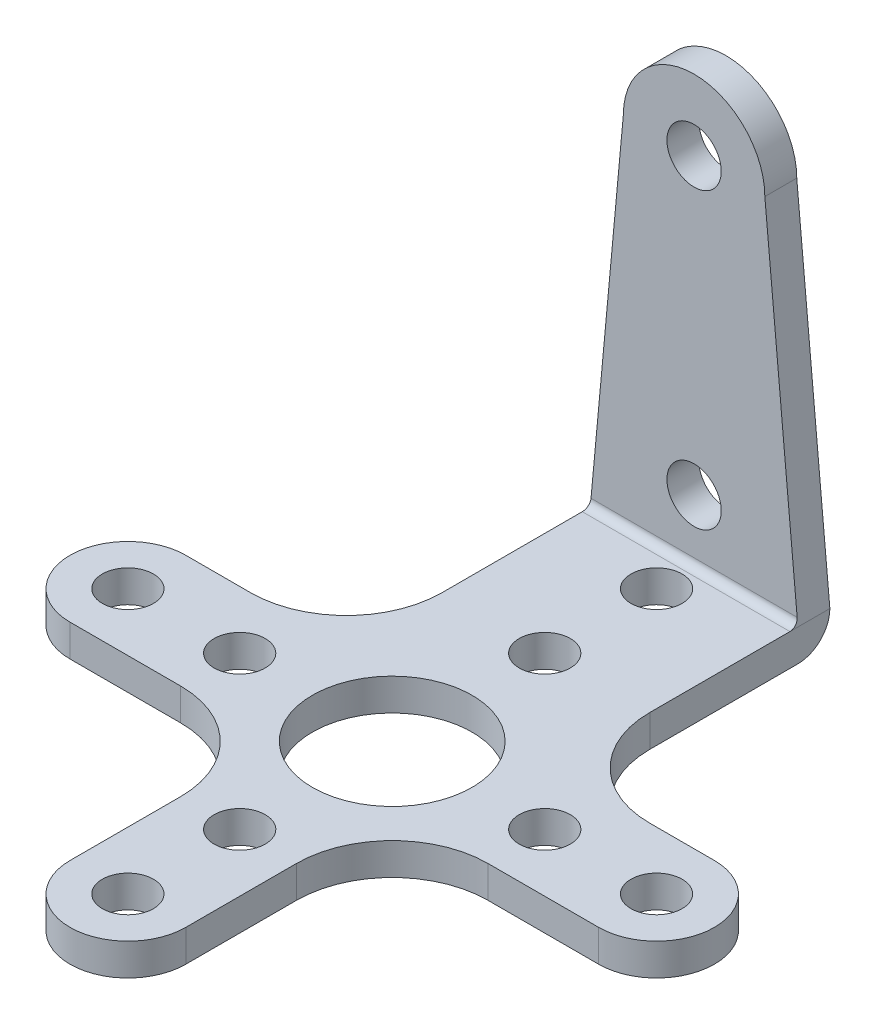
ISO-10303-21;
HEADER;
FILE_DESCRIPTION(('STEP AP214'),'2;1');
FILE_NAME('part.step','',(''),(''),'','','');
FILE_SCHEMA(('AUTOMOTIVE_DESIGN { 1 0 10303 214 1 1 1 1 }'));
ENDSEC;
DATA;
#1=APPLICATION_CONTEXT('core data for automotive mechanical design processes');
#2=APPLICATION_PROTOCOL_DEFINITION('international standard','automotive_design',2000,#1);
#3=PRODUCT_CONTEXT('',#1,'mechanical');
#4=PRODUCT('Part','Part','',(#3));
#5=PRODUCT_RELATED_PRODUCT_CATEGORY('part','',(#4));
#6=PRODUCT_DEFINITION_FORMATION('','',#4);
#7=PRODUCT_DEFINITION_CONTEXT('part definition',#1,'design');
#8=PRODUCT_DEFINITION('design','',#6,#7);
#9=PRODUCT_DEFINITION_SHAPE('','',#8);
#10=(LENGTH_UNIT() NAMED_UNIT(*) SI_UNIT(.MILLI.,.METRE.));
#11=(NAMED_UNIT(*) PLANE_ANGLE_UNIT() SI_UNIT($,.RADIAN.));
#12=(NAMED_UNIT(*) SI_UNIT($,.STERADIAN.) SOLID_ANGLE_UNIT());
#13=UNCERTAINTY_MEASURE_WITH_UNIT(LENGTH_MEASURE(1.E-05),#10,'distance_accuracy_value','');
#14=(GEOMETRIC_REPRESENTATION_CONTEXT(3) GLOBAL_UNCERTAINTY_ASSIGNED_CONTEXT((#13)) GLOBAL_UNIT_ASSIGNED_CONTEXT((#10,
#11,#12)) REPRESENTATION_CONTEXT('',''));
#15=CARTESIAN_POINT('',(0.,0.,0.));
#16=DIRECTION('',(0.,0.,1.));
#17=DIRECTION('',(1.,0.,0.));
#18=AXIS2_PLACEMENT_3D('',#15,#16,#17);
#19=CARTESIAN_POINT('',(-16.55,2.,0.));
#20=DIRECTION('',(0.,-1.,0.));
#21=DIRECTION('',(0.,0.,-1.));
#22=AXIS2_PLACEMENT_3D('',#19,#20,#21);
#23=PLANE('',#22);
#24=DIRECTION('',(0.,0.,-1.));
#25=VECTOR('',#24,1.);
#26=CARTESIAN_POINT('',(6.5,2.,-9.62500000000003));
#27=LINE('',#26,#25);
#28=CARTESIAN_POINT('',(6.5,2.,-9.62500000000003));
#29=VERTEX_POINT('',#28);
#30=CARTESIAN_POINT('',(6.5,2.,-18.4));
#31=VERTEX_POINT('',#30);
#32=EDGE_CURVE('E304',#29,#31,#27,.T.);
#33=ORIENTED_EDGE('',*,*,#32,.T.);
#34=DIRECTION('',(-1.,0.,0.));
#35=VECTOR('',#34,1.);
#36=CARTESIAN_POINT('',(-6.5,2.,-18.4));
#37=LINE('',#36,#35);
#38=CARTESIAN_POINT('',(-6.5,2.,-18.4));
#39=VERTEX_POINT('',#38);
#40=EDGE_CURVE('E384',#31,#39,#37,.T.);
#41=ORIENTED_EDGE('',*,*,#40,.T.);
#42=DIRECTION('',(0.,0.,1.));
#43=VECTOR('',#42,1.);
#44=CARTESIAN_POINT('',(-6.5,2.,-9.62500000000004));
#45=LINE('',#44,#43);
#46=CARTESIAN_POINT('',(-6.5,2.,-9.62500000000004));
#47=VERTEX_POINT('',#46);
#48=EDGE_CURVE('E198',#39,#47,#45,.T.);
#49=ORIENTED_EDGE('',*,*,#48,.T.);
#50=CARTESIAN_POINT('',(-12.5,2.,-9.62499999999999));
#51=DIRECTION('',(0.,-1.,0.));
#52=DIRECTION('',(0.,0.,-1.));
#53=AXIS2_PLACEMENT_3D('',#50,#51,#52);
#54=CIRCLE('',#53,6.);
#55=CARTESIAN_POINT('',(-12.5,2.,-3.62499999999999));
#56=VERTEX_POINT('',#55);
#57=EDGE_CURVE('E307',#47,#56,#54,.T.);
#58=ORIENTED_EDGE('',*,*,#57,.T.);
#59=DIRECTION('',(-1.,0.,0.));
#60=VECTOR('',#59,1.);
#61=CARTESIAN_POINT('',(-16.55,2.,-3.62499999999999));
#62=LINE('',#61,#60);
#63=CARTESIAN_POINT('',(-16.55,2.,-3.62499999999999));
#64=VERTEX_POINT('',#63);
#65=EDGE_CURVE('E309',#56,#64,#62,.T.);
#66=ORIENTED_EDGE('',*,*,#65,.T.);
#67=CARTESIAN_POINT('',(-16.55,2.,0.));
#68=DIRECTION('',(0.,1.,0.));
#69=DIRECTION('',(0.,0.,-1.));
#70=AXIS2_PLACEMENT_3D('',#67,#68,#69);
#71=CIRCLE('',#70,3.625);
#72=CARTESIAN_POINT('',(-16.55,2.,3.625));
#73=VERTEX_POINT('',#72);
#74=EDGE_CURVE('E280',#64,#73,#71,.T.);
#75=ORIENTED_EDGE('',*,*,#74,.T.);
#76=DIRECTION('',(1.,0.,0.));
#77=VECTOR('',#76,1.);
#78=CARTESIAN_POINT('',(-16.55,2.,3.625));
#79=LINE('',#78,#77);
#80=CARTESIAN_POINT('',(-9.62499999999988,2.,3.625));
#81=VERTEX_POINT('',#80);
#82=EDGE_CURVE('E283',#73,#81,#79,.T.);
#83=ORIENTED_EDGE('',*,*,#82,.T.);
#84=CARTESIAN_POINT('',(-9.62499999999984,2.,9.625));
#85=DIRECTION('',(0.,-1.,0.));
#86=DIRECTION('',(0.,0.,1.));
#87=AXIS2_PLACEMENT_3D('',#84,#85,#86);
#88=CIRCLE('',#87,6.);
#89=CARTESIAN_POINT('',(-3.62499999999984,2.,9.62499999999994));
#90=VERTEX_POINT('',#89);
#91=EDGE_CURVE('E286',#81,#90,#88,.T.);
#92=ORIENTED_EDGE('',*,*,#91,.T.);
#93=DIRECTION('',(0.,0.,1.));
#94=VECTOR('',#93,1.);
#95=CARTESIAN_POINT('',(-3.62499999999972,2.,16.5500000000001));
#96=LINE('',#95,#94);
#97=CARTESIAN_POINT('',(-3.62499999999972,2.,16.5500000000001));
#98=VERTEX_POINT('',#97);
#99=EDGE_CURVE('E288',#90,#98,#96,.T.);
#100=ORIENTED_EDGE('',*,*,#99,.T.);
#101=CARTESIAN_POINT('',(2.81025203108243E-13,2.,16.55));
#102=DIRECTION('',(0.,1.,0.));
#103=DIRECTION('',(0.,0.,1.));
#104=AXIS2_PLACEMENT_3D('',#101,#102,#103);
#105=CIRCLE('',#104,3.625);
#106=CARTESIAN_POINT('',(3.62500000000028,2.,16.5499999999999));
#107=VERTEX_POINT('',#106);
#108=EDGE_CURVE('E290',#98,#107,#105,.T.);
#109=ORIENTED_EDGE('',*,*,#108,.T.);
#110=DIRECTION('',(0.,0.,-1.));
#111=VECTOR('',#110,1.);
#112=CARTESIAN_POINT('',(3.62500000000028,2.,16.5499999999999));
#113=LINE('',#112,#111);
#114=CARTESIAN_POINT('',(3.62499999999998,2.,9.62500000000026));
#115=VERTEX_POINT('',#114);
#116=EDGE_CURVE('E292',#107,#115,#113,.T.);
#117=ORIENTED_EDGE('',*,*,#116,.T.);
#118=CARTESIAN_POINT('',(9.6250000000001,2.,9.62500000000001));
#119=DIRECTION('',(0.,-1.,0.));
#120=DIRECTION('',(0.,0.,1.));
#121=AXIS2_PLACEMENT_3D('',#118,#119,#120);
#122=CIRCLE('',#121,6.00000000000006);
#123=CARTESIAN_POINT('',(9.62499999999998,2.,3.62499999999995));
#124=VERTEX_POINT('',#123);
#125=EDGE_CURVE('E294',#115,#124,#122,.T.);
#126=ORIENTED_EDGE('',*,*,#125,.T.);
#127=DIRECTION('',(1.,0.,0.));
#128=VECTOR('',#127,1.);
#129=CARTESIAN_POINT('',(16.55,2.,3.62500000000001));
#130=LINE('',#129,#128);
#131=CARTESIAN_POINT('',(16.55,2.,3.62500000000001));
#132=VERTEX_POINT('',#131);
#133=EDGE_CURVE('E296',#124,#132,#130,.T.);
#134=ORIENTED_EDGE('',*,*,#133,.T.);
#135=CARTESIAN_POINT('',(16.55,2.,0.));
#136=DIRECTION('',(0.,1.,0.));
#137=DIRECTION('',(0.,0.,1.));
#138=AXIS2_PLACEMENT_3D('',#135,#136,#137);
#139=CIRCLE('',#138,3.625);
#140=CARTESIAN_POINT('',(16.55,2.,-3.62500000000001));
#141=VERTEX_POINT('',#140);
#142=EDGE_CURVE('E298',#132,#141,#139,.T.);
#143=ORIENTED_EDGE('',*,*,#142,.T.);
#144=DIRECTION('',(-1.,0.,0.));
#145=VECTOR('',#144,1.);
#146=CARTESIAN_POINT('',(16.55,2.,-3.62499999999999));
#147=LINE('',#146,#145);
#148=CARTESIAN_POINT('',(12.5,2.,-3.62499999999999));
#149=VERTEX_POINT('',#148);
#150=EDGE_CURVE('E300',#141,#149,#147,.T.);
#151=ORIENTED_EDGE('',*,*,#150,.T.);
#152=CARTESIAN_POINT('',(12.5,2.,-9.62499999999999));
#153=DIRECTION('',(0.,-1.,0.));
#154=DIRECTION('',(0.,0.,-1.));
#155=AXIS2_PLACEMENT_3D('',#152,#153,#154);
#156=CIRCLE('',#155,6.);
#157=EDGE_CURVE('E302',#149,#29,#156,.T.);
#158=ORIENTED_EDGE('',*,*,#157,.T.);
#159=EDGE_LOOP('',(#33,#41,#49,#58,#66,#75,#83,#92,#100,#109,#117,#126,#134,#143,#151,#158));
#160=FACE_BOUND('',#159,.T.);
#161=CARTESIAN_POINT('',(0.,2.,0.));
#162=DIRECTION('',(0.,1.,0.));
#163=DIRECTION('',(0.,0.,1.));
#164=AXIS2_PLACEMENT_3D('',#161,#162,#163);
#165=CIRCLE('',#164,5.);
#166=CARTESIAN_POINT('',(0.,2.,5.));
#167=VERTEX_POINT('',#166);
#168=EDGE_CURVE('E274',#167,#167,#165,.T.);
#169=ORIENTED_EDGE('',*,*,#168,.F.);
#170=EDGE_LOOP('',(#169));
#171=FACE_BOUND('',#170,.T.);
#172=CARTESIAN_POINT('',(-9.55,2.,0.));
#173=DIRECTION('',(0.,1.,0.));
#174=DIRECTION('',(0.,0.,1.));
#175=AXIS2_PLACEMENT_3D('',#172,#173,#174);
#176=CIRCLE('',#175,1.6);
#177=CARTESIAN_POINT('',(-9.55,2.,1.6));
#178=VERTEX_POINT('',#177);
#179=EDGE_CURVE('E268',#178,#178,#176,.T.);
#180=ORIENTED_EDGE('',*,*,#179,.F.);
#181=EDGE_LOOP('',(#180));
#182=FACE_BOUND('',#181,.T.);
#183=CARTESIAN_POINT('',(-16.55,2.,0.));
#184=DIRECTION('',(0.,1.,0.));
#185=DIRECTION('',(0.,0.,1.));
#186=AXIS2_PLACEMENT_3D('',#183,#184,#185);
#187=CIRCLE('',#186,1.6);
#188=CARTESIAN_POINT('',(-16.55,2.,1.6));
#189=VERTEX_POINT('',#188);
#190=EDGE_CURVE('E262',#189,#189,#187,.T.);
#191=ORIENTED_EDGE('',*,*,#190,.F.);
#192=EDGE_LOOP('',(#191));
#193=FACE_BOUND('',#192,.T.);
#194=CARTESIAN_POINT('',(9.55,2.,0.));
#195=DIRECTION('',(0.,1.,0.));
#196=DIRECTION('',(0.,0.,-1.));
#197=AXIS2_PLACEMENT_3D('',#194,#195,#196);
#198=CIRCLE('',#197,1.6);
#199=CARTESIAN_POINT('',(9.55,2.,-1.6));
#200=VERTEX_POINT('',#199);
#201=EDGE_CURVE('E256',#200,#200,#198,.T.);
#202=ORIENTED_EDGE('',*,*,#201,.F.);
#203=EDGE_LOOP('',(#202));
#204=FACE_BOUND('',#203,.T.);
#205=CARTESIAN_POINT('',(16.55,2.,0.));
#206=DIRECTION('',(0.,1.,0.));
#207=DIRECTION('',(0.,0.,-1.));
#208=AXIS2_PLACEMENT_3D('',#205,#206,#207);
#209=CIRCLE('',#208,1.6);
#210=CARTESIAN_POINT('',(16.55,2.,-1.60000000000001));
#211=VERTEX_POINT('',#210);
#212=EDGE_CURVE('E250',#211,#211,#209,.T.);
#213=ORIENTED_EDGE('',*,*,#212,.F.);
#214=EDGE_LOOP('',(#213));
#215=FACE_BOUND('',#214,.T.);
#216=CARTESIAN_POINT('',(1.6306400674182E-13,2.,9.55));
#217=DIRECTION('',(0.,1.,0.));
#218=DIRECTION('',(0.,0.,-1.));
#219=AXIS2_PLACEMENT_3D('',#216,#217,#218);
#220=CIRCLE('',#219,1.6);
#221=CARTESIAN_POINT('',(1.6306400674182E-13,2.,7.95));
#222=VERTEX_POINT('',#221);
#223=EDGE_CURVE('E244',#222,#222,#220,.T.);
#224=ORIENTED_EDGE('',*,*,#223,.F.);
#225=EDGE_LOOP('',(#224));
#226=FACE_BOUND('',#225,.T.);
#227=CARTESIAN_POINT('',(2.81025203108243E-13,2.,16.55));
#228=DIRECTION('',(0.,1.,0.));
#229=DIRECTION('',(0.,0.,-1.));
#230=AXIS2_PLACEMENT_3D('',#227,#228,#229);
#231=CIRCLE('',#230,1.60000000000001);
#232=CARTESIAN_POINT('',(2.81025203108243E-13,2.,14.95));
#233=VERTEX_POINT('',#232);
#234=EDGE_CURVE('E238',#233,#233,#231,.T.);
#235=ORIENTED_EDGE('',*,*,#234,.F.);
#236=EDGE_LOOP('',(#235));
#237=FACE_BOUND('',#236,.T.);
#238=CARTESIAN_POINT('',(2.81025203108243E-13,2.,-16.55));
#239=DIRECTION('',(0.,1.,0.));
#240=DIRECTION('',(0.,0.,1.));
#241=AXIS2_PLACEMENT_3D('',#238,#239,#240);
#242=CIRCLE('',#241,1.60000000000001);
#243=CARTESIAN_POINT('',(2.81025203108243E-13,2.,-14.95));
#244=VERTEX_POINT('',#243);
#245=EDGE_CURVE('E232',#244,#244,#242,.T.);
#246=ORIENTED_EDGE('',*,*,#245,.F.);
#247=EDGE_LOOP('',(#246));
#248=FACE_BOUND('',#247,.T.);
#249=CARTESIAN_POINT('',(1.6306400674182E-13,2.,-9.55));
#250=DIRECTION('',(0.,1.,0.));
#251=DIRECTION('',(0.,0.,1.));
#252=AXIS2_PLACEMENT_3D('',#249,#250,#251);
#253=CIRCLE('',#252,1.6);
#254=CARTESIAN_POINT('',(1.6306400674182E-13,2.,-7.95));
#255=VERTEX_POINT('',#254);
#256=EDGE_CURVE('E226',#255,#255,#253,.T.);
#257=ORIENTED_EDGE('',*,*,#256,.F.);
#258=EDGE_LOOP('',(#257));
#259=FACE_BOUND('',#258,.T.);
#260=ADVANCED_FACE('F33',(#160,#171,#182,#193,#204,#215,#226,#237,#248,#259),#23,.F.);
#261=CARTESIAN_POINT('',(-16.55,0.,0.));
#262=DIRECTION('',(0.,-1.,0.));
#263=DIRECTION('',(0.,0.,-1.));
#264=AXIS2_PLACEMENT_3D('',#261,#262,#263);
#265=PLANE('',#264);
#266=CARTESIAN_POINT('',(2.81025203108243E-13,0.,-16.55));
#267=DIRECTION('',(0.,1.,0.));
#268=DIRECTION('',(0.,0.,1.));
#269=AXIS2_PLACEMENT_3D('',#266,#267,#268);
#270=CIRCLE('',#269,1.60000000000001);
#271=CARTESIAN_POINT('',(2.81025203108243E-13,0.,-14.95));
#272=VERTEX_POINT('',#271);
#273=EDGE_CURVE('E229',#272,#272,#270,.T.);
#274=ORIENTED_EDGE('',*,*,#273,.T.);
#275=EDGE_LOOP('',(#274));
#276=FACE_BOUND('',#275,.T.);
#277=CARTESIAN_POINT('',(1.6306400674182E-13,0.,9.55));
#278=DIRECTION('',(0.,1.,0.));
#279=DIRECTION('',(0.,0.,-1.));
#280=AXIS2_PLACEMENT_3D('',#277,#278,#279);
#281=CIRCLE('',#280,1.6);
#282=CARTESIAN_POINT('',(1.6306400674182E-13,0.,7.95));
#283=VERTEX_POINT('',#282);
#284=EDGE_CURVE('E241',#283,#283,#281,.T.);
#285=ORIENTED_EDGE('',*,*,#284,.T.);
#286=EDGE_LOOP('',(#285));
#287=FACE_BOUND('',#286,.T.);
#288=CARTESIAN_POINT('',(9.55,0.,0.));
#289=DIRECTION('',(0.,1.,0.));
#290=DIRECTION('',(0.,0.,-1.));
#291=AXIS2_PLACEMENT_3D('',#288,#289,#290);
#292=CIRCLE('',#291,1.6);
#293=CARTESIAN_POINT('',(9.55,0.,-1.6));
#294=VERTEX_POINT('',#293);
#295=EDGE_CURVE('E253',#294,#294,#292,.T.);
#296=ORIENTED_EDGE('',*,*,#295,.T.);
#297=EDGE_LOOP('',(#296));
#298=FACE_BOUND('',#297,.T.);
#299=CARTESIAN_POINT('',(-9.55,0.,0.));
#300=DIRECTION('',(0.,1.,0.));
#301=DIRECTION('',(0.,0.,1.));
#302=AXIS2_PLACEMENT_3D('',#299,#300,#301);
#303=CIRCLE('',#302,1.6);
#304=CARTESIAN_POINT('',(-9.55,0.,1.6));
#305=VERTEX_POINT('',#304);
#306=EDGE_CURVE('E265',#305,#305,#303,.T.);
#307=ORIENTED_EDGE('',*,*,#306,.T.);
#308=EDGE_LOOP('',(#307));
#309=FACE_BOUND('',#308,.T.);
#310=DIRECTION('',(0.,0.,1.));
#311=VECTOR('',#310,1.);
#312=CARTESIAN_POINT('',(-6.5,0.,-9.62500000000004));
#313=LINE('',#312,#311);
#314=CARTESIAN_POINT('',(-6.5,0.,-18.9));
#315=VERTEX_POINT('',#314);
#316=CARTESIAN_POINT('',(-6.5,0.,-9.62500000000004));
#317=VERTEX_POINT('',#316);
#318=EDGE_CURVE('E336',#315,#317,#313,.T.);
#319=ORIENTED_EDGE('',*,*,#318,.F.);
#320=DIRECTION('',(-1.,0.,0.));
#321=VECTOR('',#320,1.);
#322=CARTESIAN_POINT('',(-16.55,0.,-18.9));
#323=LINE('',#322,#321);
#324=CARTESIAN_POINT('',(6.5,0.,-18.9));
#325=VERTEX_POINT('',#324);
#326=EDGE_CURVE('E72',#315,#325,#323,.F.);
#327=ORIENTED_EDGE('',*,*,#326,.T.);
#328=DIRECTION('',(0.,0.,-1.));
#329=VECTOR('',#328,1.);
#330=CARTESIAN_POINT('',(6.5,0.,-9.62500000000003));
#331=LINE('',#330,#329);
#332=CARTESIAN_POINT('',(6.5,0.,-9.62500000000003));
#333=VERTEX_POINT('',#332);
#334=EDGE_CURVE('E334',#333,#325,#331,.T.);
#335=ORIENTED_EDGE('',*,*,#334,.F.);
#336=CARTESIAN_POINT('',(12.5,0.,-9.62499999999999));
#337=DIRECTION('',(0.,-1.,0.));
#338=DIRECTION('',(0.,0.,-1.));
#339=AXIS2_PLACEMENT_3D('',#336,#337,#338);
#340=CIRCLE('',#339,6.);
#341=CARTESIAN_POINT('',(12.5,0.,-3.62499999999999));
#342=VERTEX_POINT('',#341);
#343=EDGE_CURVE('E332',#342,#333,#340,.T.);
#344=ORIENTED_EDGE('',*,*,#343,.F.);
#345=DIRECTION('',(-1.,0.,0.));
#346=VECTOR('',#345,1.);
#347=CARTESIAN_POINT('',(16.55,0.,-3.62499999999999));
#348=LINE('',#347,#346);
#349=CARTESIAN_POINT('',(16.55,0.,-3.62500000000001));
#350=VERTEX_POINT('',#349);
#351=EDGE_CURVE('E330',#350,#342,#348,.T.);
#352=ORIENTED_EDGE('',*,*,#351,.F.);
#353=CARTESIAN_POINT('',(16.55,0.,0.));
#354=DIRECTION('',(0.,1.,0.));
#355=DIRECTION('',(0.,0.,1.));
#356=AXIS2_PLACEMENT_3D('',#353,#354,#355);
#357=CIRCLE('',#356,3.625);
#358=CARTESIAN_POINT('',(16.55,0.,3.62500000000001));
#359=VERTEX_POINT('',#358);
#360=EDGE_CURVE('E328',#359,#350,#357,.T.);
#361=ORIENTED_EDGE('',*,*,#360,.F.);
#362=DIRECTION('',(1.,0.,0.));
#363=VECTOR('',#362,1.);
#364=CARTESIAN_POINT('',(16.55,0.,3.62500000000001));
#365=LINE('',#364,#363);
#366=CARTESIAN_POINT('',(9.62499999999998,0.,3.62499999999995));
#367=VERTEX_POINT('',#366);
#368=EDGE_CURVE('E326',#367,#359,#365,.T.);
#369=ORIENTED_EDGE('',*,*,#368,.F.);
#370=CARTESIAN_POINT('',(9.6250000000001,0.,9.62500000000001));
#371=DIRECTION('',(0.,-1.,0.));
#372=DIRECTION('',(0.,0.,1.));
#373=AXIS2_PLACEMENT_3D('',#370,#371,#372);
#374=CIRCLE('',#373,6.00000000000006);
#375=CARTESIAN_POINT('',(3.62499999999998,0.,9.62500000000026));
#376=VERTEX_POINT('',#375);
#377=EDGE_CURVE('E324',#376,#367,#374,.T.);
#378=ORIENTED_EDGE('',*,*,#377,.F.);
#379=DIRECTION('',(0.,0.,-1.));
#380=VECTOR('',#379,1.);
#381=CARTESIAN_POINT('',(3.62500000000028,0.,16.5499999999999));
#382=LINE('',#381,#380);
#383=CARTESIAN_POINT('',(3.62500000000028,0.,16.5499999999999));
#384=VERTEX_POINT('',#383);
#385=EDGE_CURVE('E322',#384,#376,#382,.T.);
#386=ORIENTED_EDGE('',*,*,#385,.F.);
#387=CARTESIAN_POINT('',(2.81025203108243E-13,0.,16.55));
#388=DIRECTION('',(0.,1.,0.));
#389=DIRECTION('',(0.,0.,1.));
#390=AXIS2_PLACEMENT_3D('',#387,#388,#389);
#391=CIRCLE('',#390,3.625);
#392=CARTESIAN_POINT('',(-3.62499999999972,0.,16.5500000000001));
#393=VERTEX_POINT('',#392);
#394=EDGE_CURVE('E320',#393,#384,#391,.T.);
#395=ORIENTED_EDGE('',*,*,#394,.F.);
#396=DIRECTION('',(0.,0.,1.));
#397=VECTOR('',#396,1.);
#398=CARTESIAN_POINT('',(-3.62499999999972,0.,16.5500000000001));
#399=LINE('',#398,#397);
#400=CARTESIAN_POINT('',(-3.62499999999984,0.,9.62499999999994));
#401=VERTEX_POINT('',#400);
#402=EDGE_CURVE('E318',#401,#393,#399,.T.);
#403=ORIENTED_EDGE('',*,*,#402,.F.);
#404=CARTESIAN_POINT('',(-9.62499999999984,0.,9.625));
#405=DIRECTION('',(0.,-1.,0.));
#406=DIRECTION('',(0.,0.,1.));
#407=AXIS2_PLACEMENT_3D('',#404,#405,#406);
#408=CIRCLE('',#407,6.);
#409=CARTESIAN_POINT('',(-9.62499999999988,0.,3.625));
#410=VERTEX_POINT('',#409);
#411=EDGE_CURVE('E316',#410,#401,#408,.T.);
#412=ORIENTED_EDGE('',*,*,#411,.F.);
#413=DIRECTION('',(1.,0.,0.));
#414=VECTOR('',#413,1.);
#415=CARTESIAN_POINT('',(-16.55,0.,3.625));
#416=LINE('',#415,#414);
#417=CARTESIAN_POINT('',(-16.55,0.,3.625));
#418=VERTEX_POINT('',#417);
#419=EDGE_CURVE('E314',#418,#410,#416,.T.);
#420=ORIENTED_EDGE('',*,*,#419,.F.);
#421=CARTESIAN_POINT('',(-16.55,0.,0.));
#422=DIRECTION('',(0.,1.,0.));
#423=DIRECTION('',(0.,0.,-1.));
#424=AXIS2_PLACEMENT_3D('',#421,#422,#423);
#425=CIRCLE('',#424,3.625);
#426=CARTESIAN_POINT('',(-16.55,0.,-3.62499999999999));
#427=VERTEX_POINT('',#426);
#428=EDGE_CURVE('E277',#427,#418,#425,.T.);
#429=ORIENTED_EDGE('',*,*,#428,.F.);
#430=DIRECTION('',(-1.,0.,0.));
#431=VECTOR('',#430,1.);
#432=CARTESIAN_POINT('',(-16.55,0.,-3.62499999999999));
#433=LINE('',#432,#431);
#434=CARTESIAN_POINT('',(-12.5,0.,-3.62499999999999));
#435=VERTEX_POINT('',#434);
#436=EDGE_CURVE('E284',#435,#427,#433,.T.);
#437=ORIENTED_EDGE('',*,*,#436,.F.);
#438=CARTESIAN_POINT('',(-12.5,0.,-9.62499999999999));
#439=DIRECTION('',(0.,-1.,0.));
#440=DIRECTION('',(0.,0.,-1.));
#441=AXIS2_PLACEMENT_3D('',#438,#439,#440);
#442=CIRCLE('',#441,6.);
#443=EDGE_CURVE('E338',#317,#435,#442,.T.);
#444=ORIENTED_EDGE('',*,*,#443,.F.);
#445=EDGE_LOOP('',(#319,#327,#335,#344,#352,#361,#369,#378,#386,#395,#403,#412,#420,#429,#437,#444));
#446=FACE_BOUND('',#445,.T.);
#447=CARTESIAN_POINT('',(0.,0.,0.));
#448=DIRECTION('',(0.,1.,0.));
#449=DIRECTION('',(0.,0.,1.));
#450=AXIS2_PLACEMENT_3D('',#447,#448,#449);
#451=CIRCLE('',#450,5.);
#452=CARTESIAN_POINT('',(0.,0.,5.));
#453=VERTEX_POINT('',#452);
#454=EDGE_CURVE('E271',#453,#453,#451,.T.);
#455=ORIENTED_EDGE('',*,*,#454,.T.);
#456=EDGE_LOOP('',(#455));
#457=FACE_BOUND('',#456,.T.);
#458=CARTESIAN_POINT('',(-16.55,0.,0.));
#459=DIRECTION('',(0.,1.,0.));
#460=DIRECTION('',(0.,0.,1.));
#461=AXIS2_PLACEMENT_3D('',#458,#459,#460);
#462=CIRCLE('',#461,1.6);
#463=CARTESIAN_POINT('',(-16.55,0.,1.6));
#464=VERTEX_POINT('',#463);
#465=EDGE_CURVE('E259',#464,#464,#462,.T.);
#466=ORIENTED_EDGE('',*,*,#465,.T.);
#467=EDGE_LOOP('',(#466));
#468=FACE_BOUND('',#467,.T.);
#469=CARTESIAN_POINT('',(16.55,0.,0.));
#470=DIRECTION('',(0.,1.,0.));
#471=DIRECTION('',(0.,0.,-1.));
#472=AXIS2_PLACEMENT_3D('',#469,#470,#471);
#473=CIRCLE('',#472,1.6);
#474=CARTESIAN_POINT('',(16.55,0.,-1.60000000000001));
#475=VERTEX_POINT('',#474);
#476=EDGE_CURVE('E247',#475,#475,#473,.T.);
#477=ORIENTED_EDGE('',*,*,#476,.T.);
#478=EDGE_LOOP('',(#477));
#479=FACE_BOUND('',#478,.T.);
#480=CARTESIAN_POINT('',(2.81025203108243E-13,0.,16.55));
#481=DIRECTION('',(0.,1.,0.));
#482=DIRECTION('',(0.,0.,-1.));
#483=AXIS2_PLACEMENT_3D('',#480,#481,#482);
#484=CIRCLE('',#483,1.60000000000001);
#485=CARTESIAN_POINT('',(2.81025203108243E-13,0.,14.95));
#486=VERTEX_POINT('',#485);
#487=EDGE_CURVE('E235',#486,#486,#484,.T.);
#488=ORIENTED_EDGE('',*,*,#487,.T.);
#489=EDGE_LOOP('',(#488));
#490=FACE_BOUND('',#489,.T.);
#491=CARTESIAN_POINT('',(1.6306400674182E-13,0.,-9.55));
#492=DIRECTION('',(0.,1.,0.));
#493=DIRECTION('',(0.,0.,1.));
#494=AXIS2_PLACEMENT_3D('',#491,#492,#493);
#495=CIRCLE('',#494,1.6);
#496=CARTESIAN_POINT('',(1.6306400674182E-13,0.,-7.95));
#497=VERTEX_POINT('',#496);
#498=EDGE_CURVE('E199',#497,#497,#495,.T.);
#499=ORIENTED_EDGE('',*,*,#498,.T.);
#500=EDGE_LOOP('',(#499));
#501=FACE_BOUND('',#500,.T.);
#502=ADVANCED_FACE('F407',(#276,#287,#298,#309,#446,#457,#468,#479,#490,#501),#265,.T.);
#503=CARTESIAN_POINT('',(-16.55,2.,0.));
#504=DIRECTION('',(0.,-1.,0.));
#505=DIRECTION('',(0.,0.,-1.));
#506=AXIS2_PLACEMENT_3D('',#503,#504,#505);
#507=CYLINDRICAL_SURFACE('',#506,3.625);
#508=ORIENTED_EDGE('',*,*,#428,.T.);
#509=DIRECTION('',(0.,-1.,0.));
#510=VECTOR('',#509,1.);
#511=CARTESIAN_POINT('',(-16.55,2.,3.625));
#512=LINE('',#511,#510);
#513=EDGE_CURVE('E193',#73,#418,#512,.T.);
#514=ORIENTED_EDGE('',*,*,#513,.F.);
#515=ORIENTED_EDGE('',*,*,#74,.F.);
#516=DIRECTION('',(0.,-1.,0.));
#517=VECTOR('',#516,1.);
#518=CARTESIAN_POINT('',(-16.55,2.,-3.62499999999999));
#519=LINE('',#518,#517);
#520=EDGE_CURVE('E311',#64,#427,#519,.T.);
#521=ORIENTED_EDGE('',*,*,#520,.T.);
#522=EDGE_LOOP('',(#508,#514,#515,#521));
#523=FACE_BOUND('',#522,.T.);
#524=ADVANCED_FACE('F458',(#523),#507,.T.);
#525=CARTESIAN_POINT('',(-16.55,2.,3.625));
#526=DIRECTION('',(0.,0.,-1.));
#527=DIRECTION('',(-1.,0.,0.));
#528=AXIS2_PLACEMENT_3D('',#525,#526,#527);
#529=PLANE('',#528);
#530=ORIENTED_EDGE('',*,*,#419,.T.);
#531=DIRECTION('',(0.,-1.,0.));
#532=VECTOR('',#531,1.);
#533=CARTESIAN_POINT('',(-9.62499999999988,2.,3.625));
#534=LINE('',#533,#532);
#535=EDGE_CURVE('E376',#81,#410,#534,.T.);
#536=ORIENTED_EDGE('',*,*,#535,.F.);
#537=ORIENTED_EDGE('',*,*,#82,.F.);
#538=ORIENTED_EDGE('',*,*,#513,.T.);
#539=EDGE_LOOP('',(#530,#536,#537,#538));
#540=FACE_BOUND('',#539,.T.);
#541=ADVANCED_FACE('F455',(#540),#529,.F.);
#542=CARTESIAN_POINT('',(-9.62499999999984,2.,9.625));
#543=DIRECTION('',(0.,-1.,0.));
#544=DIRECTION('',(0.,0.,-1.));
#545=AXIS2_PLACEMENT_3D('',#542,#543,#544);
#546=CYLINDRICAL_SURFACE('',#545,6.);
#547=ORIENTED_EDGE('',*,*,#411,.T.);
#548=DIRECTION('',(0.,-1.,0.));
#549=VECTOR('',#548,1.);
#550=CARTESIAN_POINT('',(-3.62499999999984,2.,9.62499999999994));
#551=LINE('',#550,#549);
#552=EDGE_CURVE('E373',#90,#401,#551,.T.);
#553=ORIENTED_EDGE('',*,*,#552,.F.);
#554=ORIENTED_EDGE('',*,*,#91,.F.);
#555=ORIENTED_EDGE('',*,*,#535,.T.);
#556=EDGE_LOOP('',(#547,#553,#554,#555));
#557=FACE_BOUND('',#556,.T.);
#558=ADVANCED_FACE('F449',(#557),#546,.F.);
#559=CARTESIAN_POINT('',(-3.62499999999972,2.,16.5500000000001));
#560=DIRECTION('',(1.,0.,0.));
#561=DIRECTION('',(0.,0.,-1.));
#562=AXIS2_PLACEMENT_3D('',#559,#560,#561);
#563=PLANE('',#562);
#564=ORIENTED_EDGE('',*,*,#402,.T.);
#565=DIRECTION('',(0.,-1.,0.));
#566=VECTOR('',#565,1.);
#567=CARTESIAN_POINT('',(-3.62499999999972,2.,16.5500000000001));
#568=LINE('',#567,#566);
#569=EDGE_CURVE('E370',#98,#393,#568,.T.);
#570=ORIENTED_EDGE('',*,*,#569,.F.);
#571=ORIENTED_EDGE('',*,*,#99,.F.);
#572=ORIENTED_EDGE('',*,*,#552,.T.);
#573=EDGE_LOOP('',(#564,#570,#571,#572));
#574=FACE_BOUND('',#573,.T.);
#575=ADVANCED_FACE('F445',(#574),#563,.F.);
#576=CARTESIAN_POINT('',(2.81025203108243E-13,2.,16.55));
#577=DIRECTION('',(0.,-1.,0.));
#578=DIRECTION('',(0.,0.,-1.));
#579=AXIS2_PLACEMENT_3D('',#576,#577,#578);
#580=CYLINDRICAL_SURFACE('',#579,3.625);
#581=ORIENTED_EDGE('',*,*,#394,.T.);
#582=DIRECTION('',(0.,-1.,0.));
#583=VECTOR('',#582,1.);
#584=CARTESIAN_POINT('',(3.62500000000028,2.,16.5499999999999));
#585=LINE('',#584,#583);
#586=EDGE_CURVE('E367',#107,#384,#585,.T.);
#587=ORIENTED_EDGE('',*,*,#586,.F.);
#588=ORIENTED_EDGE('',*,*,#108,.F.);
#589=ORIENTED_EDGE('',*,*,#569,.T.);
#590=EDGE_LOOP('',(#581,#587,#588,#589));
#591=FACE_BOUND('',#590,.T.);
#592=ADVANCED_FACE('F440',(#591),#580,.T.);
#593=CARTESIAN_POINT('',(3.62500000000028,2.,16.5499999999999));
#594=DIRECTION('',(-1.,0.,0.));
#595=DIRECTION('',(0.,0.,1.));
#596=AXIS2_PLACEMENT_3D('',#593,#594,#595);
#597=PLANE('',#596);
#598=ORIENTED_EDGE('',*,*,#385,.T.);
#599=DIRECTION('',(0.,-1.,0.));
#600=VECTOR('',#599,1.);
#601=CARTESIAN_POINT('',(3.62499999999998,2.,9.62500000000026));
#602=LINE('',#601,#600);
#603=EDGE_CURVE('E364',#115,#376,#602,.T.);
#604=ORIENTED_EDGE('',*,*,#603,.F.);
#605=ORIENTED_EDGE('',*,*,#116,.F.);
#606=ORIENTED_EDGE('',*,*,#586,.T.);
#607=EDGE_LOOP('',(#598,#604,#605,#606));
#608=FACE_BOUND('',#607,.T.);
#609=ADVANCED_FACE('F434',(#608),#597,.F.);
#610=CARTESIAN_POINT('',(9.6250000000001,2.,9.62500000000001));
#611=DIRECTION('',(0.,-1.,0.));
#612=DIRECTION('',(0.,0.,-1.));
#613=AXIS2_PLACEMENT_3D('',#610,#611,#612);
#614=CYLINDRICAL_SURFACE('',#613,6.00000000000006);
#615=ORIENTED_EDGE('',*,*,#377,.T.);
#616=DIRECTION('',(0.,-1.,0.));
#617=VECTOR('',#616,1.);
#618=CARTESIAN_POINT('',(9.62499999999998,2.,3.62499999999995));
#619=LINE('',#618,#617);
#620=EDGE_CURVE('E361',#124,#367,#619,.T.);
#621=ORIENTED_EDGE('',*,*,#620,.F.);
#622=ORIENTED_EDGE('',*,*,#125,.F.);
#623=ORIENTED_EDGE('',*,*,#603,.T.);
#624=EDGE_LOOP('',(#615,#621,#622,#623));
#625=FACE_BOUND('',#624,.T.);
#626=ADVANCED_FACE('F430',(#625),#614,.F.);
#627=CARTESIAN_POINT('',(16.55,2.,3.62500000000001));
#628=DIRECTION('',(0.,0.,-1.));
#629=DIRECTION('',(-1.,0.,0.));
#630=AXIS2_PLACEMENT_3D('',#627,#628,#629);
#631=PLANE('',#630);
#632=ORIENTED_EDGE('',*,*,#368,.T.);
#633=DIRECTION('',(0.,-1.,0.));
#634=VECTOR('',#633,1.);
#635=CARTESIAN_POINT('',(16.55,2.,3.62500000000001));
#636=LINE('',#635,#634);
#637=EDGE_CURVE('E358',#132,#359,#636,.T.);
#638=ORIENTED_EDGE('',*,*,#637,.F.);
#639=ORIENTED_EDGE('',*,*,#133,.F.);
#640=ORIENTED_EDGE('',*,*,#620,.T.);
#641=EDGE_LOOP('',(#632,#638,#639,#640));
#642=FACE_BOUND('',#641,.T.);
#643=ADVANCED_FACE('F425',(#642),#631,.F.);
#644=CARTESIAN_POINT('',(16.55,2.,0.));
#645=DIRECTION('',(0.,-1.,0.));
#646=DIRECTION('',(0.,0.,-1.));
#647=AXIS2_PLACEMENT_3D('',#644,#645,#646);
#648=CYLINDRICAL_SURFACE('',#647,3.625);
#649=ORIENTED_EDGE('',*,*,#360,.T.);
#650=DIRECTION('',(0.,-1.,0.));
#651=VECTOR('',#650,1.);
#652=CARTESIAN_POINT('',(16.55,2.,-3.62500000000001));
#653=LINE('',#652,#651);
#654=EDGE_CURVE('E355',#141,#350,#653,.T.);
#655=ORIENTED_EDGE('',*,*,#654,.F.);
#656=ORIENTED_EDGE('',*,*,#142,.F.);
#657=ORIENTED_EDGE('',*,*,#637,.T.);
#658=EDGE_LOOP('',(#649,#655,#656,#657));
#659=FACE_BOUND('',#658,.T.);
#660=ADVANCED_FACE('F419',(#659),#648,.T.);
#661=CARTESIAN_POINT('',(16.55,2.,-3.62499999999999));
#662=DIRECTION('',(0.,0.,1.));
#663=DIRECTION('',(1.,0.,0.));
#664=AXIS2_PLACEMENT_3D('',#661,#662,#663);
#665=PLANE('',#664);
#666=ORIENTED_EDGE('',*,*,#351,.T.);
#667=DIRECTION('',(0.,-1.,0.));
#668=VECTOR('',#667,1.);
#669=CARTESIAN_POINT('',(12.5,2.,-3.62499999999999));
#670=LINE('',#669,#668);
#671=EDGE_CURVE('E352',#149,#342,#670,.T.);
#672=ORIENTED_EDGE('',*,*,#671,.F.);
#673=ORIENTED_EDGE('',*,*,#150,.F.);
#674=ORIENTED_EDGE('',*,*,#654,.T.);
#675=EDGE_LOOP('',(#666,#672,#673,#674));
#676=FACE_BOUND('',#675,.T.);
#677=ADVANCED_FACE('F415',(#676),#665,.F.);
#678=CARTESIAN_POINT('',(12.5,2.,-9.62499999999999));
#679=DIRECTION('',(0.,-1.,0.));
#680=DIRECTION('',(0.,0.,-1.));
#681=AXIS2_PLACEMENT_3D('',#678,#679,#680);
#682=CYLINDRICAL_SURFACE('',#681,6.);
#683=ORIENTED_EDGE('',*,*,#343,.T.);
#684=DIRECTION('',(0.,-1.,0.));
#685=VECTOR('',#684,1.);
#686=CARTESIAN_POINT('',(6.5,2.,-9.62500000000003));
#687=LINE('',#686,#685);
#688=EDGE_CURVE('E349',#29,#333,#687,.T.);
#689=ORIENTED_EDGE('',*,*,#688,.F.);
#690=ORIENTED_EDGE('',*,*,#157,.F.);
#691=ORIENTED_EDGE('',*,*,#671,.T.);
#692=EDGE_LOOP('',(#683,#689,#690,#691));
#693=FACE_BOUND('',#692,.T.);
#694=ADVANCED_FACE('F411',(#693),#682,.F.);
#695=CARTESIAN_POINT('',(6.5,2.,-9.62500000000003));
#696=DIRECTION('',(-1.,0.,0.));
#697=DIRECTION('',(0.,0.,1.));
#698=AXIS2_PLACEMENT_3D('',#695,#696,#697);
#699=PLANE('',#698);
#700=ORIENTED_EDGE('',*,*,#334,.T.);
#701=CARTESIAN_POINT('',(6.5,2.,-18.9));
#702=DIRECTION('',(-1.,0.,0.));
#703=DIRECTION('',(0.,0.,1.));
#704=AXIS2_PLACEMENT_3D('',#701,#702,#703);
#705=CIRCLE('',#704,2.);
#706=CARTESIAN_POINT('',(6.5,2.,-20.9));
#707=VERTEX_POINT('',#706);
#708=EDGE_CURVE('E382',#325,#707,#705,.F.);
#709=ORIENTED_EDGE('',*,*,#708,.T.);
#710=DIRECTION('',(0.,0.,1.));
#711=VECTOR('',#710,1.);
#712=CARTESIAN_POINT('',(6.5,2.,-20.9));
#713=LINE('',#712,#711);
#714=EDGE_CURVE('E48',#707,#31,#713,.T.);
#715=ORIENTED_EDGE('',*,*,#714,.T.);
#716=ORIENTED_EDGE('',*,*,#32,.F.);
#717=ORIENTED_EDGE('',*,*,#688,.T.);
#718=EDGE_LOOP('',(#700,#709,#715,#716,#717));
#719=FACE_BOUND('',#718,.T.);
#720=ADVANCED_FACE('F404',(#719),#699,.F.);
#721=CARTESIAN_POINT('',(-6.5,2.,-9.62500000000004));
#722=DIRECTION('',(1.,0.,0.));
#723=DIRECTION('',(0.,0.,-1.));
#724=AXIS2_PLACEMENT_3D('',#721,#722,#723);
#725=PLANE('',#724);
#726=DIRECTION('',(0.,0.,1.));
#727=VECTOR('',#726,1.);
#728=CARTESIAN_POINT('',(-6.5,2.,-20.9));
#729=LINE('',#728,#727);
#730=CARTESIAN_POINT('',(-6.5,2.,-20.9));
#731=VERTEX_POINT('',#730);
#732=EDGE_CURVE('E65',#731,#39,#729,.T.);
#733=ORIENTED_EDGE('',*,*,#732,.F.);
#734=CARTESIAN_POINT('',(-6.5,2.,-18.9));
#735=DIRECTION('',(1.,0.,0.));
#736=DIRECTION('',(0.,0.,-1.));
#737=AXIS2_PLACEMENT_3D('',#734,#735,#736);
#738=CIRCLE('',#737,2.);
#739=EDGE_CURVE('E178',#731,#315,#738,.F.);
#740=ORIENTED_EDGE('',*,*,#739,.T.);
#741=ORIENTED_EDGE('',*,*,#318,.T.);
#742=DIRECTION('',(0.,-1.,0.));
#743=VECTOR('',#742,1.);
#744=CARTESIAN_POINT('',(-6.5,2.,-9.62500000000004));
#745=LINE('',#744,#743);
#746=EDGE_CURVE('E346',#47,#317,#745,.T.);
#747=ORIENTED_EDGE('',*,*,#746,.F.);
#748=ORIENTED_EDGE('',*,*,#48,.F.);
#749=EDGE_LOOP('',(#733,#740,#741,#747,#748));
#750=FACE_BOUND('',#749,.T.);
#751=ADVANCED_FACE('F196',(#750),#725,.F.);
#752=CARTESIAN_POINT('',(-12.5,2.,-9.62499999999999));
#753=DIRECTION('',(0.,-1.,0.));
#754=DIRECTION('',(0.,0.,-1.));
#755=AXIS2_PLACEMENT_3D('',#752,#753,#754);
#756=CYLINDRICAL_SURFACE('',#755,6.);
#757=ORIENTED_EDGE('',*,*,#443,.T.);
#758=DIRECTION('',(0.,-1.,0.));
#759=VECTOR('',#758,1.);
#760=CARTESIAN_POINT('',(-12.5,2.,-3.62499999999999));
#761=LINE('',#760,#759);
#762=EDGE_CURVE('E343',#56,#435,#761,.T.);
#763=ORIENTED_EDGE('',*,*,#762,.F.);
#764=ORIENTED_EDGE('',*,*,#57,.F.);
#765=ORIENTED_EDGE('',*,*,#746,.T.);
#766=EDGE_LOOP('',(#757,#763,#764,#765));
#767=FACE_BOUND('',#766,.T.);
#768=ADVANCED_FACE('F466',(#767),#756,.F.);
#769=CARTESIAN_POINT('',(-16.55,2.,-3.62499999999999));
#770=DIRECTION('',(0.,0.,1.));
#771=DIRECTION('',(1.,0.,0.));
#772=AXIS2_PLACEMENT_3D('',#769,#770,#771);
#773=PLANE('',#772);
#774=ORIENTED_EDGE('',*,*,#436,.T.);
#775=ORIENTED_EDGE('',*,*,#520,.F.);
#776=ORIENTED_EDGE('',*,*,#65,.F.);
#777=ORIENTED_EDGE('',*,*,#762,.T.);
#778=EDGE_LOOP('',(#774,#775,#776,#777));
#779=FACE_BOUND('',#778,.T.);
#780=ADVANCED_FACE('F462',(#779),#773,.F.);
#781=CARTESIAN_POINT('',(0.,2.,0.));
#782=DIRECTION('',(0.,-1.,0.));
#783=DIRECTION('',(0.,0.,-1.));
#784=AXIS2_PLACEMENT_3D('',#781,#782,#783);
#785=CYLINDRICAL_SURFACE('',#784,5.);
#786=ORIENTED_EDGE('',*,*,#168,.T.);
#787=EDGE_LOOP('',(#786));
#788=FACE_BOUND('',#787,.T.);
#789=ORIENTED_EDGE('',*,*,#454,.F.);
#790=EDGE_LOOP('',(#789));
#791=FACE_BOUND('',#790,.T.);
#792=ADVANCED_FACE('F474',(#788,#791),#785,.F.);
#793=CARTESIAN_POINT('',(-9.55,2.,0.));
#794=DIRECTION('',(0.,-1.,0.));
#795=DIRECTION('',(0.,0.,-1.));
#796=AXIS2_PLACEMENT_3D('',#793,#794,#795);
#797=CYLINDRICAL_SURFACE('',#796,1.6);
#798=ORIENTED_EDGE('',*,*,#179,.T.);
#799=EDGE_LOOP('',(#798));
#800=FACE_BOUND('',#799,.T.);
#801=ORIENTED_EDGE('',*,*,#306,.F.);
#802=EDGE_LOOP('',(#801));
#803=FACE_BOUND('',#802,.T.);
#804=ADVANCED_FACE('F487',(#800,#803),#797,.F.);
#805=CARTESIAN_POINT('',(-16.55,2.,0.));
#806=DIRECTION('',(0.,-1.,0.));
#807=DIRECTION('',(0.,0.,-1.));
#808=AXIS2_PLACEMENT_3D('',#805,#806,#807);
#809=CYLINDRICAL_SURFACE('',#808,1.6);
#810=ORIENTED_EDGE('',*,*,#190,.T.);
#811=EDGE_LOOP('',(#810));
#812=FACE_BOUND('',#811,.T.);
#813=ORIENTED_EDGE('',*,*,#465,.F.);
#814=EDGE_LOOP('',(#813));
#815=FACE_BOUND('',#814,.T.);
#816=ADVANCED_FACE('F491',(#812,#815),#809,.F.);
#817=CARTESIAN_POINT('',(9.55,2.,0.));
#818=DIRECTION('',(0.,-1.,0.));
#819=DIRECTION('',(0.,0.,-1.));
#820=AXIS2_PLACEMENT_3D('',#817,#818,#819);
#821=CYLINDRICAL_SURFACE('',#820,1.6);
#822=ORIENTED_EDGE('',*,*,#201,.T.);
#823=EDGE_LOOP('',(#822));
#824=FACE_BOUND('',#823,.T.);
#825=ORIENTED_EDGE('',*,*,#295,.F.);
#826=EDGE_LOOP('',(#825));
#827=FACE_BOUND('',#826,.T.);
#828=ADVANCED_FACE('F495',(#824,#827),#821,.F.);
#829=CARTESIAN_POINT('',(16.55,2.,0.));
#830=DIRECTION('',(0.,-1.,0.));
#831=DIRECTION('',(0.,0.,-1.));
#832=AXIS2_PLACEMENT_3D('',#829,#830,#831);
#833=CYLINDRICAL_SURFACE('',#832,1.6);
#834=ORIENTED_EDGE('',*,*,#212,.T.);
#835=EDGE_LOOP('',(#834));
#836=FACE_BOUND('',#835,.T.);
#837=ORIENTED_EDGE('',*,*,#476,.F.);
#838=EDGE_LOOP('',(#837));
#839=FACE_BOUND('',#838,.T.);
#840=ADVANCED_FACE('F499',(#836,#839),#833,.F.);
#841=CARTESIAN_POINT('',(1.6306400674182E-13,2.,9.55));
#842=DIRECTION('',(0.,-1.,0.));
#843=DIRECTION('',(0.,0.,-1.));
#844=AXIS2_PLACEMENT_3D('',#841,#842,#843);
#845=CYLINDRICAL_SURFACE('',#844,1.6);
#846=ORIENTED_EDGE('',*,*,#223,.T.);
#847=EDGE_LOOP('',(#846));
#848=FACE_BOUND('',#847,.T.);
#849=ORIENTED_EDGE('',*,*,#284,.F.);
#850=EDGE_LOOP('',(#849));
#851=FACE_BOUND('',#850,.T.);
#852=ADVANCED_FACE('F503',(#848,#851),#845,.F.);
#853=CARTESIAN_POINT('',(2.81025203108243E-13,2.,16.55));
#854=DIRECTION('',(0.,-1.,0.));
#855=DIRECTION('',(0.,0.,-1.));
#856=AXIS2_PLACEMENT_3D('',#853,#854,#855);
#857=CYLINDRICAL_SURFACE('',#856,1.60000000000001);
#858=ORIENTED_EDGE('',*,*,#234,.T.);
#859=EDGE_LOOP('',(#858));
#860=FACE_BOUND('',#859,.T.);
#861=ORIENTED_EDGE('',*,*,#487,.F.);
#862=EDGE_LOOP('',(#861));
#863=FACE_BOUND('',#862,.T.);
#864=ADVANCED_FACE('F507',(#860,#863),#857,.F.);
#865=CARTESIAN_POINT('',(2.81025203108243E-13,2.,-16.55));
#866=DIRECTION('',(0.,-1.,0.));
#867=DIRECTION('',(0.,0.,-1.));
#868=AXIS2_PLACEMENT_3D('',#865,#866,#867);
#869=CYLINDRICAL_SURFACE('',#868,1.60000000000001);
#870=ORIENTED_EDGE('',*,*,#245,.T.);
#871=EDGE_LOOP('',(#870));
#872=FACE_BOUND('',#871,.T.);
#873=ORIENTED_EDGE('',*,*,#273,.F.);
#874=EDGE_LOOP('',(#873));
#875=FACE_BOUND('',#874,.T.);
#876=ADVANCED_FACE('F511',(#872,#875),#869,.F.);
#877=CARTESIAN_POINT('',(1.6306400674182E-13,2.,-9.55));
#878=DIRECTION('',(0.,-1.,0.));
#879=DIRECTION('',(0.,0.,-1.));
#880=AXIS2_PLACEMENT_3D('',#877,#878,#879);
#881=CYLINDRICAL_SURFACE('',#880,1.6);
#882=ORIENTED_EDGE('',*,*,#256,.T.);
#883=EDGE_LOOP('',(#882));
#884=FACE_BOUND('',#883,.T.);
#885=ORIENTED_EDGE('',*,*,#498,.F.);
#886=EDGE_LOOP('',(#885));
#887=FACE_BOUND('',#886,.T.);
#888=ADVANCED_FACE('F515',(#884,#887),#881,.F.);
#889=CARTESIAN_POINT('',(0.,24.3,-20.9));
#890=DIRECTION('',(0.,0.,-1.));
#891=DIRECTION('',(-1.,0.,0.));
#892=AXIS2_PLACEMENT_3D('',#889,#890,#891);
#893=PLANE('',#892);
#894=CARTESIAN_POINT('',(0.,24.3,-20.9));
#895=DIRECTION('',(0.,0.,-1.));
#896=DIRECTION('',(-1.,0.,0.));
#897=AXIS2_PLACEMENT_3D('',#894,#895,#896);
#898=CIRCLE('',#897,1.7);
#899=CARTESIAN_POINT('',(-1.7,24.3,-20.9));
#900=VERTEX_POINT('',#899);
#901=EDGE_CURVE('E219',#900,#900,#898,.T.);
#902=ORIENTED_EDGE('',*,*,#901,.F.);
#903=EDGE_LOOP('',(#902));
#904=FACE_BOUND('',#903,.T.);
#905=DIRECTION('',(0.0924593852619125,-0.995716456666751,0.));
#906=VECTOR('',#905,1.);
#907=CARTESIAN_POINT('',(6.5,2.,-20.9));
#908=LINE('',#907,#906);
#909=CARTESIAN_POINT('',(4.42928571428572,24.3,-20.9));
#910=VERTEX_POINT('',#909);
#911=EDGE_CURVE('E192',#910,#707,#908,.T.);
#912=ORIENTED_EDGE('',*,*,#911,.T.);
#913=DIRECTION('',(-1.,0.,0.));
#914=VECTOR('',#913,1.);
#915=CARTESIAN_POINT('',(0.,2.,-20.9));
#916=LINE('',#915,#914);
#917=EDGE_CURVE('E182',#707,#731,#916,.T.);
#918=ORIENTED_EDGE('',*,*,#917,.T.);
#919=DIRECTION('',(0.0924593852619125,0.995716456666751,0.));
#920=VECTOR('',#919,1.);
#921=CARTESIAN_POINT('',(-4.42928571428572,24.3,-20.9));
#922=LINE('',#921,#920);
#923=CARTESIAN_POINT('',(-4.42928571428572,24.3,-20.9));
#924=VERTEX_POINT('',#923);
#925=EDGE_CURVE('E189',#731,#924,#922,.T.);
#926=ORIENTED_EDGE('',*,*,#925,.T.);
#927=CARTESIAN_POINT('',(0.,24.3,-20.9));
#928=DIRECTION('',(0.,0.,-1.));
#929=DIRECTION('',(-1.,0.,0.));
#930=AXIS2_PLACEMENT_3D('',#927,#928,#929);
#931=CIRCLE('',#930,4.42928571428572);
#932=EDGE_CURVE('E205',#924,#910,#931,.T.);
#933=ORIENTED_EDGE('',*,*,#932,.T.);
#934=EDGE_LOOP('',(#912,#918,#926,#933));
#935=FACE_BOUND('',#934,.T.);
#936=CARTESIAN_POINT('',(0.,5.9,-20.9));
#937=DIRECTION('',(0.,0.,-1.));
#938=DIRECTION('',(-1.,0.,0.));
#939=AXIS2_PLACEMENT_3D('',#936,#937,#938);
#940=CIRCLE('',#939,1.7);
#941=CARTESIAN_POINT('',(-1.7,5.9,-20.9));
#942=VERTEX_POINT('',#941);
#943=EDGE_CURVE('E546',#942,#942,#940,.T.);
#944=ORIENTED_EDGE('',*,*,#943,.F.);
#945=EDGE_LOOP('',(#944));
#946=FACE_BOUND('',#945,.T.);
#947=ADVANCED_FACE('F187',(#904,#935,#946),#893,.T.);
#948=CARTESIAN_POINT('',(0.,24.3,-18.9));
#949=DIRECTION('',(0.,0.,-1.));
#950=DIRECTION('',(-1.,0.,0.));
#951=AXIS2_PLACEMENT_3D('',#948,#949,#950);
#952=PLANE('',#951);
#953=DIRECTION('',(0.0924593852619125,0.995716456666751,0.));
#954=VECTOR('',#953,1.);
#955=CARTESIAN_POINT('',(-4.42928571428572,24.3,-18.9));
#956=LINE('',#955,#954);
#957=CARTESIAN_POINT('',(-6.45357142857143,2.50000000000001,-18.9));
#958=VERTEX_POINT('',#957);
#959=CARTESIAN_POINT('',(-4.42928571428572,24.3,-18.9));
#960=VERTEX_POINT('',#959);
#961=EDGE_CURVE('E217',#958,#960,#956,.T.);
#962=ORIENTED_EDGE('',*,*,#961,.F.);
#963=DIRECTION('',(-1.,0.,0.));
#964=VECTOR('',#963,1.);
#965=CARTESIAN_POINT('',(6.5,2.5,-18.9));
#966=LINE('',#965,#964);
#967=CARTESIAN_POINT('',(6.45357142857143,2.5,-18.9));
#968=VERTEX_POINT('',#967);
#969=EDGE_CURVE('E387',#958,#968,#966,.F.);
#970=ORIENTED_EDGE('',*,*,#969,.T.);
#971=DIRECTION('',(0.0924593852619125,-0.995716456666751,0.));
#972=VECTOR('',#971,1.);
#973=CARTESIAN_POINT('',(6.5,2.,-18.9));
#974=LINE('',#973,#972);
#975=CARTESIAN_POINT('',(4.42928571428572,24.3,-18.9));
#976=VERTEX_POINT('',#975);
#977=EDGE_CURVE('E206',#976,#968,#974,.T.);
#978=ORIENTED_EDGE('',*,*,#977,.F.);
#979=CARTESIAN_POINT('',(0.,24.3,-18.9));
#980=DIRECTION('',(0.,0.,-1.));
#981=DIRECTION('',(-1.,0.,0.));
#982=AXIS2_PLACEMENT_3D('',#979,#980,#981);
#983=CIRCLE('',#982,4.42928571428572);
#984=EDGE_CURVE('E210',#960,#976,#983,.T.);
#985=ORIENTED_EDGE('',*,*,#984,.F.);
#986=EDGE_LOOP('',(#962,#970,#978,#985));
#987=FACE_BOUND('',#986,.T.);
#988=CARTESIAN_POINT('',(0.,24.3,-18.9));
#989=DIRECTION('',(0.,0.,-1.));
#990=DIRECTION('',(-1.,0.,0.));
#991=AXIS2_PLACEMENT_3D('',#988,#989,#990);
#992=CIRCLE('',#991,1.7);
#993=CARTESIAN_POINT('',(-1.7,24.3,-18.9));
#994=VERTEX_POINT('',#993);
#995=EDGE_CURVE('E213',#994,#994,#992,.T.);
#996=ORIENTED_EDGE('',*,*,#995,.T.);
#997=EDGE_LOOP('',(#996));
#998=FACE_BOUND('',#997,.T.);
#999=CARTESIAN_POINT('',(0.,5.9,-18.9));
#1000=DIRECTION('',(0.,0.,-1.));
#1001=DIRECTION('',(-1.,0.,0.));
#1002=AXIS2_PLACEMENT_3D('',#999,#1000,#1001);
#1003=CIRCLE('',#1002,1.7);
#1004=CARTESIAN_POINT('',(-1.7,5.9,-18.9));
#1005=VERTEX_POINT('',#1004);
#1006=EDGE_CURVE('E549',#1005,#1005,#1003,.T.);
#1007=ORIENTED_EDGE('',*,*,#1006,.T.);
#1008=EDGE_LOOP('',(#1007));
#1009=FACE_BOUND('',#1008,.T.);
#1010=ADVANCED_FACE('F391',(#987,#998,#1009),#952,.F.);
#1011=CARTESIAN_POINT('',(-4.42928571428572,24.3,-20.9));
#1012=DIRECTION('',(0.995716456666751,-0.0924593852619125,0.));
#1013=DIRECTION('',(0.0924593852619125,0.995716456666751,0.));
#1014=AXIS2_PLACEMENT_3D('',#1011,#1012,#1013);
#1015=PLANE('',#1014);
#1016=ORIENTED_EDGE('',*,*,#732,.T.);
#1017=CARTESIAN_POINT('',(-6.45357142857143,2.5,-18.4));
#1018=DIRECTION('',(0.995716456666751,-0.0924593852619125,0.));
#1019=DIRECTION('',(0.0924593852619125,0.995716456666751,0.));
#1020=AXIS2_PLACEMENT_3D('',#1017,#1018,#1019);
#1021=ELLIPSE('',#1020,0.50215098550625,0.5);
#1022=EDGE_CURVE('E41',#39,#958,#1021,.T.);
#1023=ORIENTED_EDGE('',*,*,#1022,.T.);
#1024=ORIENTED_EDGE('',*,*,#961,.T.);
#1025=DIRECTION('',(0.,0.,1.));
#1026=VECTOR('',#1025,1.);
#1027=CARTESIAN_POINT('',(-4.42928571428572,24.3,-20.9));
#1028=LINE('',#1027,#1026);
#1029=EDGE_CURVE('E200',#924,#960,#1028,.T.);
#1030=ORIENTED_EDGE('',*,*,#1029,.F.);
#1031=ORIENTED_EDGE('',*,*,#925,.F.);
#1032=EDGE_LOOP('',(#1016,#1023,#1024,#1030,#1031));
#1033=FACE_BOUND('',#1032,.T.);
#1034=ADVANCED_FACE('F202',(#1033),#1015,.F.);
#1035=CARTESIAN_POINT('',(0.,24.3,-20.9));
#1036=DIRECTION('',(0.,0.,1.));
#1037=DIRECTION('',(1.,0.,0.));
#1038=AXIS2_PLACEMENT_3D('',#1035,#1036,#1037);
#1039=CYLINDRICAL_SURFACE('',#1038,4.42928571428572);
#1040=ORIENTED_EDGE('',*,*,#984,.T.);
#1041=DIRECTION('',(0.,0.,1.));
#1042=VECTOR('',#1041,1.);
#1043=CARTESIAN_POINT('',(4.42928571428572,24.3,-20.9));
#1044=LINE('',#1043,#1042);
#1045=EDGE_CURVE('E222',#910,#976,#1044,.T.);
#1046=ORIENTED_EDGE('',*,*,#1045,.F.);
#1047=ORIENTED_EDGE('',*,*,#932,.F.);
#1048=ORIENTED_EDGE('',*,*,#1029,.T.);
#1049=EDGE_LOOP('',(#1040,#1046,#1047,#1048));
#1050=FACE_BOUND('',#1049,.T.);
#1051=ADVANCED_FACE('F522',(#1050),#1039,.T.);
#1052=CARTESIAN_POINT('',(6.5,2.,-20.9));
#1053=DIRECTION('',(-0.995716456666751,-0.0924593852619125,0.));
#1054=DIRECTION('',(0.0924593852619125,-0.995716456666751,0.));
#1055=AXIS2_PLACEMENT_3D('',#1052,#1053,#1054);
#1056=PLANE('',#1055);
#1057=ORIENTED_EDGE('',*,*,#977,.T.);
#1058=CARTESIAN_POINT('',(6.45357142857143,2.5,-18.4));
#1059=DIRECTION('',(-0.995716456666751,-0.0924593852619125,0.));
#1060=DIRECTION('',(0.0924593852619125,-0.995716456666751,0.));
#1061=AXIS2_PLACEMENT_3D('',#1058,#1059,#1060);
#1062=ELLIPSE('',#1061,0.50215098550625,0.5);
#1063=EDGE_CURVE('E11',#968,#31,#1062,.T.);
#1064=ORIENTED_EDGE('',*,*,#1063,.T.);
#1065=ORIENTED_EDGE('',*,*,#714,.F.);
#1066=ORIENTED_EDGE('',*,*,#911,.F.);
#1067=ORIENTED_EDGE('',*,*,#1045,.T.);
#1068=EDGE_LOOP('',(#1057,#1064,#1065,#1066,#1067));
#1069=FACE_BOUND('',#1068,.T.);
#1070=ADVANCED_FACE('F397',(#1069),#1056,.F.);
#1071=CARTESIAN_POINT('',(0.,24.3,-20.9));
#1072=DIRECTION('',(0.,0.,1.));
#1073=DIRECTION('',(1.,0.,0.));
#1074=AXIS2_PLACEMENT_3D('',#1071,#1072,#1073);
#1075=CYLINDRICAL_SURFACE('',#1074,1.7);
#1076=ORIENTED_EDGE('',*,*,#901,.T.);
#1077=EDGE_LOOP('',(#1076));
#1078=FACE_BOUND('',#1077,.T.);
#1079=ORIENTED_EDGE('',*,*,#995,.F.);
#1080=EDGE_LOOP('',(#1079));
#1081=FACE_BOUND('',#1080,.T.);
#1082=ADVANCED_FACE('F528',(#1078,#1081),#1075,.F.);
#1083=CARTESIAN_POINT('',(0.,5.9,-20.9));
#1084=DIRECTION('',(0.,0.,1.));
#1085=DIRECTION('',(1.,0.,0.));
#1086=AXIS2_PLACEMENT_3D('',#1083,#1084,#1085);
#1087=CYLINDRICAL_SURFACE('',#1086,1.7);
#1088=ORIENTED_EDGE('',*,*,#943,.T.);
#1089=EDGE_LOOP('',(#1088));
#1090=FACE_BOUND('',#1089,.T.);
#1091=ORIENTED_EDGE('',*,*,#1006,.F.);
#1092=EDGE_LOOP('',(#1091));
#1093=FACE_BOUND('',#1092,.T.);
#1094=ADVANCED_FACE('F536',(#1090,#1093),#1087,.F.);
#1095=CARTESIAN_POINT('',(0.,2.,-18.9));
#1096=DIRECTION('',(-1.,0.,0.));
#1097=DIRECTION('',(0.,0.,1.));
#1098=AXIS2_PLACEMENT_3D('',#1095,#1096,#1097);
#1099=CYLINDRICAL_SURFACE('',#1098,2.);
#1100=ORIENTED_EDGE('',*,*,#708,.F.);
#1101=ORIENTED_EDGE('',*,*,#326,.F.);
#1102=ORIENTED_EDGE('',*,*,#739,.F.);
#1103=ORIENTED_EDGE('',*,*,#917,.F.);
#1104=EDGE_LOOP('',(#1100,#1101,#1102,#1103));
#1105=FACE_BOUND('',#1104,.T.);
#1106=ADVANCED_FACE('F181',(#1105),#1099,.T.);
#1107=CARTESIAN_POINT('',(-16.55,2.5,-18.4));
#1108=DIRECTION('',(1.,0.,0.));
#1109=DIRECTION('',(0.,0.,-1.));
#1110=AXIS2_PLACEMENT_3D('',#1107,#1108,#1109);
#1111=CYLINDRICAL_SURFACE('',#1110,0.5);
#1112=ORIENTED_EDGE('',*,*,#1063,.F.);
#1113=ORIENTED_EDGE('',*,*,#969,.F.);
#1114=ORIENTED_EDGE('',*,*,#1022,.F.);
#1115=ORIENTED_EDGE('',*,*,#40,.F.);
#1116=EDGE_LOOP('',(#1112,#1113,#1114,#1115));
#1117=FACE_BOUND('',#1116,.T.);
#1118=ADVANCED_FACE('F35',(#1117),#1111,.F.);
#1119=CLOSED_SHELL('',(#260,#502,#524,#541,#558,#575,#592,#609,#626,#643,#660,#677,#694,#720,
#751,#768,#780,#792,#804,#816,#828,#840,#852,#864,#876,#888,#947,#1010,#1034,#1051,#1070,#1082,
#1094,#1106,#1118));
#1120=MANIFOLD_SOLID_BREP('B2',#1119);
#1121=ADVANCED_BREP_SHAPE_REPRESENTATION('',(#18,#1120),#14);
#1122=SHAPE_DEFINITION_REPRESENTATION(#9,#1121);
ENDSEC;
END-ISO-10303-21;
